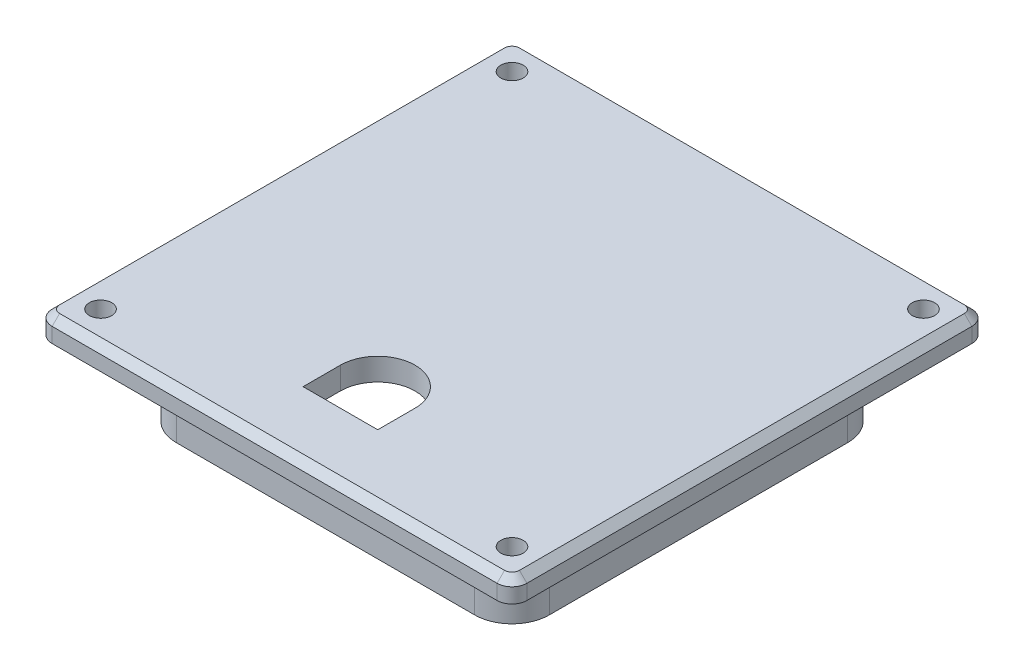
ISO-10303-21;
HEADER;
FILE_DESCRIPTION(('STEP AP214'),'2;1');
FILE_NAME('part.step','',(''),(''),'','','');
FILE_SCHEMA(('AUTOMOTIVE_DESIGN { 1 0 10303 214 1 1 1 1 }'));
ENDSEC;
DATA;
#1=APPLICATION_CONTEXT('core data for automotive mechanical design processes');
#2=APPLICATION_PROTOCOL_DEFINITION('international standard','automotive_design',2000,#1);
#3=PRODUCT_CONTEXT('',#1,'mechanical');
#4=PRODUCT('Part','Part','',(#3));
#5=PRODUCT_RELATED_PRODUCT_CATEGORY('part','',(#4));
#6=PRODUCT_DEFINITION_FORMATION('','',#4);
#7=PRODUCT_DEFINITION_CONTEXT('part definition',#1,'design');
#8=PRODUCT_DEFINITION('design','',#6,#7);
#9=PRODUCT_DEFINITION_SHAPE('','',#8);
#10=(LENGTH_UNIT() NAMED_UNIT(*) SI_UNIT(.MILLI.,.METRE.));
#11=(NAMED_UNIT(*) PLANE_ANGLE_UNIT() SI_UNIT($,.RADIAN.));
#12=(NAMED_UNIT(*) SI_UNIT($,.STERADIAN.) SOLID_ANGLE_UNIT());
#13=UNCERTAINTY_MEASURE_WITH_UNIT(LENGTH_MEASURE(1.E-05),#10,'distance_accuracy_value','');
#14=(GEOMETRIC_REPRESENTATION_CONTEXT(3) GLOBAL_UNCERTAINTY_ASSIGNED_CONTEXT((#13)) GLOBAL_UNIT_ASSIGNED_CONTEXT((#10,
#11,#12)) REPRESENTATION_CONTEXT('',''));
#15=CARTESIAN_POINT('',(0.,0.,0.));
#16=DIRECTION('',(0.,0.,1.));
#17=DIRECTION('',(1.,0.,0.));
#18=AXIS2_PLACEMENT_3D('',#15,#16,#17);
#19=CARTESIAN_POINT('',(0.,0.,0.));
#20=DIRECTION('',(0.,1.,0.));
#21=DIRECTION('',(0.,0.,1.));
#22=AXIS2_PLACEMENT_3D('',#19,#20,#21);
#23=PLANE('',#22);
#24=DIRECTION('',(1.,0.,0.));
#25=VECTOR('',#24,1.);
#26=CARTESIAN_POINT('',(-25.,0.,25.));
#27=LINE('',#26,#25);
#28=CARTESIAN_POINT('',(-20.,0.,25.));
#29=VERTEX_POINT('',#28);
#30=CARTESIAN_POINT('',(20.,0.,25.));
#31=VERTEX_POINT('',#30);
#32=EDGE_CURVE('E354',#29,#31,#27,.T.);
#33=ORIENTED_EDGE('',*,*,#32,.F.);
#34=CARTESIAN_POINT('',(-20.,0.,20.));
#35=DIRECTION('',(0.,1.,0.));
#36=DIRECTION('',(0.,0.,1.));
#37=AXIS2_PLACEMENT_3D('',#34,#35,#36);
#38=CIRCLE('',#37,5.);
#39=CARTESIAN_POINT('',(-25.,0.,20.));
#40=VERTEX_POINT('',#39);
#41=EDGE_CURVE('E372',#29,#40,#38,.F.);
#42=ORIENTED_EDGE('',*,*,#41,.T.);
#43=DIRECTION('',(0.,0.,1.));
#44=VECTOR('',#43,1.);
#45=CARTESIAN_POINT('',(-25.,0.,-25.));
#46=LINE('',#45,#44);
#47=CARTESIAN_POINT('',(-25.,0.,-20.));
#48=VERTEX_POINT('',#47);
#49=EDGE_CURVE('E337',#48,#40,#46,.T.);
#50=ORIENTED_EDGE('',*,*,#49,.F.);
#51=CARTESIAN_POINT('',(-20.,0.,-20.));
#52=DIRECTION('',(0.,1.,0.));
#53=DIRECTION('',(0.,0.,1.));
#54=AXIS2_PLACEMENT_3D('',#51,#52,#53);
#55=CIRCLE('',#54,5.);
#56=CARTESIAN_POINT('',(-20.,0.,-25.));
#57=VERTEX_POINT('',#56);
#58=EDGE_CURVE('E366',#48,#57,#55,.F.);
#59=ORIENTED_EDGE('',*,*,#58,.T.);
#60=DIRECTION('',(-1.,0.,0.));
#61=VECTOR('',#60,1.);
#62=CARTESIAN_POINT('',(-25.,0.,-25.));
#63=LINE('',#62,#61);
#64=CARTESIAN_POINT('',(20.,0.,-25.));
#65=VERTEX_POINT('',#64);
#66=EDGE_CURVE('E342',#65,#57,#63,.T.);
#67=ORIENTED_EDGE('',*,*,#66,.F.);
#68=CARTESIAN_POINT('',(20.,0.,-20.));
#69=DIRECTION('',(0.,1.,0.));
#70=DIRECTION('',(0.,0.,1.));
#71=AXIS2_PLACEMENT_3D('',#68,#69,#70);
#72=CIRCLE('',#71,5.);
#73=CARTESIAN_POINT('',(25.,0.,-20.));
#74=VERTEX_POINT('',#73);
#75=EDGE_CURVE('E368',#65,#74,#72,.F.);
#76=ORIENTED_EDGE('',*,*,#75,.T.);
#77=DIRECTION('',(0.,0.,-1.));
#78=VECTOR('',#77,1.);
#79=CARTESIAN_POINT('',(25.,0.,-25.));
#80=LINE('',#79,#78);
#81=CARTESIAN_POINT('',(25.,0.,20.));
#82=VERTEX_POINT('',#81);
#83=EDGE_CURVE('E357',#82,#74,#80,.T.);
#84=ORIENTED_EDGE('',*,*,#83,.F.);
#85=CARTESIAN_POINT('',(20.,0.,20.));
#86=DIRECTION('',(0.,1.,0.));
#87=DIRECTION('',(0.,0.,1.));
#88=AXIS2_PLACEMENT_3D('',#85,#86,#87);
#89=CIRCLE('',#88,5.);
#90=EDGE_CURVE('E370',#82,#31,#89,.F.);
#91=ORIENTED_EDGE('',*,*,#90,.T.);
#92=EDGE_LOOP('',(#33,#42,#50,#59,#67,#76,#84,#91));
#93=FACE_BOUND('',#92,.T.);
#94=DIRECTION('',(0.,0.,1.));
#95=VECTOR('',#94,1.);
#96=CARTESIAN_POINT('',(-23.,0.,-23.));
#97=LINE('',#96,#95);
#98=CARTESIAN_POINT('',(-23.,0.,-23.));
#99=VERTEX_POINT('',#98);
#100=CARTESIAN_POINT('',(-23.,0.,23.));
#101=VERTEX_POINT('',#100);
#102=EDGE_CURVE('E302',#99,#101,#97,.T.);
#103=ORIENTED_EDGE('',*,*,#102,.T.);
#104=DIRECTION('',(1.,0.,0.));
#105=VECTOR('',#104,1.);
#106=CARTESIAN_POINT('',(-23.,0.,23.));
#107=LINE('',#106,#105);
#108=CARTESIAN_POINT('',(23.,0.,23.));
#109=VERTEX_POINT('',#108);
#110=EDGE_CURVE('E320',#101,#109,#107,.T.);
#111=ORIENTED_EDGE('',*,*,#110,.T.);
#112=DIRECTION('',(0.,0.,-1.));
#113=VECTOR('',#112,1.);
#114=CARTESIAN_POINT('',(23.,0.,-23.));
#115=LINE('',#114,#113);
#116=CARTESIAN_POINT('',(23.,0.,-23.));
#117=VERTEX_POINT('',#116);
#118=EDGE_CURVE('E323',#109,#117,#115,.T.);
#119=ORIENTED_EDGE('',*,*,#118,.T.);
#120=DIRECTION('',(-1.,0.,0.));
#121=VECTOR('',#120,1.);
#122=CARTESIAN_POINT('',(-23.,0.,-23.));
#123=LINE('',#122,#121);
#124=EDGE_CURVE('E307',#117,#99,#123,.T.);
#125=ORIENTED_EDGE('',*,*,#124,.T.);
#126=EDGE_LOOP('',(#103,#111,#119,#125));
#127=FACE_BOUND('',#126,.T.);
#128=ADVANCED_FACE('F39',(#93,#127),#23,.F.);
#129=CARTESIAN_POINT('',(-25.,10.,-25.));
#130=DIRECTION('',(1.,0.,0.));
#131=DIRECTION('',(0.,0.,-1.));
#132=AXIS2_PLACEMENT_3D('',#129,#130,#131);
#133=PLANE('',#132);
#134=ORIENTED_EDGE('',*,*,#49,.T.);
#135=DIRECTION('',(0.,-1.,0.));
#136=VECTOR('',#135,1.);
#137=CARTESIAN_POINT('',(-25.,10.,20.));
#138=LINE('',#137,#136);
#139=CARTESIAN_POINT('',(-25.,10.,20.));
#140=VERTEX_POINT('',#139);
#141=EDGE_CURVE('E377',#40,#140,#138,.F.);
#142=ORIENTED_EDGE('',*,*,#141,.T.);
#143=DIRECTION('',(0.,0.,1.));
#144=VECTOR('',#143,1.);
#145=CARTESIAN_POINT('',(-25.,10.,-25.));
#146=LINE('',#145,#144);
#147=CARTESIAN_POINT('',(-25.,10.,-20.));
#148=VERTEX_POINT('',#147);
#149=EDGE_CURVE('E338',#148,#140,#146,.T.);
#150=ORIENTED_EDGE('',*,*,#149,.F.);
#151=DIRECTION('',(0.,-1.,0.));
#152=VECTOR('',#151,1.);
#153=CARTESIAN_POINT('',(-25.,10.,-20.));
#154=LINE('',#153,#152);
#155=EDGE_CURVE('E374',#148,#48,#154,.T.);
#156=ORIENTED_EDGE('',*,*,#155,.T.);
#157=EDGE_LOOP('',(#134,#142,#150,#156));
#158=FACE_BOUND('',#157,.T.);
#159=ADVANCED_FACE('F550',(#158),#133,.F.);
#160=CARTESIAN_POINT('',(-25.,10.,25.));
#161=DIRECTION('',(0.,0.,-1.));
#162=DIRECTION('',(-1.,0.,0.));
#163=AXIS2_PLACEMENT_3D('',#160,#161,#162);
#164=PLANE('',#163);
#165=DIRECTION('',(1.,0.,0.));
#166=VECTOR('',#165,1.);
#167=CARTESIAN_POINT('',(-25.,10.,25.));
#168=LINE('',#167,#166);
#169=CARTESIAN_POINT('',(-20.,10.,25.));
#170=VERTEX_POINT('',#169);
#171=CARTESIAN_POINT('',(20.,10.,25.));
#172=VERTEX_POINT('',#171);
#173=EDGE_CURVE('E341',#170,#172,#168,.T.);
#174=ORIENTED_EDGE('',*,*,#173,.F.);
#175=DIRECTION('',(0.,-1.,0.));
#176=VECTOR('',#175,1.);
#177=CARTESIAN_POINT('',(-20.,10.,25.));
#178=LINE('',#177,#176);
#179=EDGE_CURVE('E363',#170,#29,#178,.T.);
#180=ORIENTED_EDGE('',*,*,#179,.T.);
#181=ORIENTED_EDGE('',*,*,#32,.T.);
#182=DIRECTION('',(0.,-1.,0.));
#183=VECTOR('',#182,1.);
#184=CARTESIAN_POINT('',(20.,10.,25.));
#185=LINE('',#184,#183);
#186=EDGE_CURVE('E351',#31,#172,#185,.F.);
#187=ORIENTED_EDGE('',*,*,#186,.T.);
#188=EDGE_LOOP('',(#174,#180,#181,#187));
#189=FACE_BOUND('',#188,.T.);
#190=ADVANCED_FACE('F556',(#189),#164,.F.);
#191=CARTESIAN_POINT('',(25.,10.,-25.));
#192=DIRECTION('',(-1.,0.,0.));
#193=DIRECTION('',(0.,0.,1.));
#194=AXIS2_PLACEMENT_3D('',#191,#192,#193);
#195=PLANE('',#194);
#196=DIRECTION('',(0.,0.,-1.));
#197=VECTOR('',#196,1.);
#198=CARTESIAN_POINT('',(25.,10.,-25.));
#199=LINE('',#198,#197);
#200=CARTESIAN_POINT('',(25.,10.,20.));
#201=VERTEX_POINT('',#200);
#202=CARTESIAN_POINT('',(25.,10.,-20.));
#203=VERTEX_POINT('',#202);
#204=EDGE_CURVE('E345',#201,#203,#199,.T.);
#205=ORIENTED_EDGE('',*,*,#204,.F.);
#206=DIRECTION('',(0.,-1.,0.));
#207=VECTOR('',#206,1.);
#208=CARTESIAN_POINT('',(25.,10.,20.));
#209=LINE('',#208,#207);
#210=EDGE_CURVE('E381',#201,#82,#209,.T.);
#211=ORIENTED_EDGE('',*,*,#210,.T.);
#212=ORIENTED_EDGE('',*,*,#83,.T.);
#213=DIRECTION('',(0.,-1.,0.));
#214=VECTOR('',#213,1.);
#215=CARTESIAN_POINT('',(25.,10.,-20.));
#216=LINE('',#215,#214);
#217=EDGE_CURVE('E379',#74,#203,#216,.F.);
#218=ORIENTED_EDGE('',*,*,#217,.T.);
#219=EDGE_LOOP('',(#205,#211,#212,#218));
#220=FACE_BOUND('',#219,.T.);
#221=ADVANCED_FACE('F568',(#220),#195,.F.);
#222=CARTESIAN_POINT('',(-25.,10.,-25.));
#223=DIRECTION('',(0.,0.,1.));
#224=DIRECTION('',(1.,0.,0.));
#225=AXIS2_PLACEMENT_3D('',#222,#223,#224);
#226=PLANE('',#225);
#227=DIRECTION('',(-1.,0.,0.));
#228=VECTOR('',#227,1.);
#229=CARTESIAN_POINT('',(-25.,10.,-25.));
#230=LINE('',#229,#228);
#231=CARTESIAN_POINT('',(20.,10.,-25.));
#232=VERTEX_POINT('',#231);
#233=CARTESIAN_POINT('',(-20.,10.,-25.));
#234=VERTEX_POINT('',#233);
#235=EDGE_CURVE('E348',#232,#234,#230,.T.);
#236=ORIENTED_EDGE('',*,*,#235,.F.);
#237=DIRECTION('',(0.,-1.,0.));
#238=VECTOR('',#237,1.);
#239=CARTESIAN_POINT('',(20.,10.,-25.));
#240=LINE('',#239,#238);
#241=EDGE_CURVE('E386',#232,#65,#240,.T.);
#242=ORIENTED_EDGE('',*,*,#241,.T.);
#243=ORIENTED_EDGE('',*,*,#66,.T.);
#244=DIRECTION('',(0.,-1.,0.));
#245=VECTOR('',#244,1.);
#246=CARTESIAN_POINT('',(-20.,10.,-25.));
#247=LINE('',#246,#245);
#248=EDGE_CURVE('E384',#57,#234,#247,.F.);
#249=ORIENTED_EDGE('',*,*,#248,.T.);
#250=EDGE_LOOP('',(#236,#242,#243,#249));
#251=FACE_BOUND('',#250,.T.);
#252=ADVANCED_FACE('F565',(#251),#226,.F.);
#253=CARTESIAN_POINT('',(-23.,10.,-23.));
#254=DIRECTION('',(1.,0.,0.));
#255=DIRECTION('',(0.,0.,-1.));
#256=AXIS2_PLACEMENT_3D('',#253,#254,#255);
#257=PLANE('',#256);
#258=ORIENTED_EDGE('',*,*,#102,.F.);
#259=DIRECTION('',(0.,-1.,0.));
#260=VECTOR('',#259,1.);
#261=CARTESIAN_POINT('',(-23.,10.,-23.));
#262=LINE('',#261,#260);
#263=CARTESIAN_POINT('',(-23.,10.,-23.));
#264=VERTEX_POINT('',#263);
#265=EDGE_CURVE('E317',#264,#99,#262,.T.);
#266=ORIENTED_EDGE('',*,*,#265,.F.);
#267=DIRECTION('',(0.,0.,1.));
#268=VECTOR('',#267,1.);
#269=CARTESIAN_POINT('',(-23.,10.,-23.));
#270=LINE('',#269,#268);
#271=CARTESIAN_POINT('',(-23.,10.,23.));
#272=VERTEX_POINT('',#271);
#273=EDGE_CURVE('E303',#264,#272,#270,.T.);
#274=ORIENTED_EDGE('',*,*,#273,.T.);
#275=DIRECTION('',(0.,-1.,0.));
#276=VECTOR('',#275,1.);
#277=CARTESIAN_POINT('',(-23.,10.,23.));
#278=LINE('',#277,#276);
#279=EDGE_CURVE('E334',#272,#101,#278,.T.);
#280=ORIENTED_EDGE('',*,*,#279,.T.);
#281=EDGE_LOOP('',(#258,#266,#274,#280));
#282=FACE_BOUND('',#281,.T.);
#283=ADVANCED_FACE('F563',(#282),#257,.T.);
#284=CARTESIAN_POINT('',(-23.,10.,23.));
#285=DIRECTION('',(0.,0.,-1.));
#286=DIRECTION('',(-1.,0.,0.));
#287=AXIS2_PLACEMENT_3D('',#284,#285,#286);
#288=PLANE('',#287);
#289=ORIENTED_EDGE('',*,*,#110,.F.);
#290=ORIENTED_EDGE('',*,*,#279,.F.);
#291=DIRECTION('',(1.,0.,0.));
#292=VECTOR('',#291,1.);
#293=CARTESIAN_POINT('',(-23.,10.,23.));
#294=LINE('',#293,#292);
#295=CARTESIAN_POINT('',(-5.,10.,23.));
#296=VERTEX_POINT('',#295);
#297=EDGE_CURVE('E308',#272,#296,#294,.T.);
#298=ORIENTED_EDGE('',*,*,#297,.T.);
#299=DIRECTION('',(0.,-1.,0.));
#300=VECTOR('',#299,1.);
#301=CARTESIAN_POINT('',(-5.,13.,23.));
#302=LINE('',#301,#300);
#303=CARTESIAN_POINT('',(-5.,13.,23.));
#304=VERTEX_POINT('',#303);
#305=EDGE_CURVE('E246',#304,#296,#302,.T.);
#306=ORIENTED_EDGE('',*,*,#305,.F.);
#307=DIRECTION('',(1.,0.,0.));
#308=VECTOR('',#307,1.);
#309=CARTESIAN_POINT('',(-5.,13.,23.));
#310=LINE('',#309,#308);
#311=CARTESIAN_POINT('',(5.,13.,23.));
#312=VERTEX_POINT('',#311);
#313=EDGE_CURVE('E251',#304,#312,#310,.T.);
#314=ORIENTED_EDGE('',*,*,#313,.T.);
#315=DIRECTION('',(0.,-1.,0.));
#316=VECTOR('',#315,1.);
#317=CARTESIAN_POINT('',(5.,13.,23.));
#318=LINE('',#317,#316);
#319=CARTESIAN_POINT('',(5.,10.,23.));
#320=VERTEX_POINT('',#319);
#321=EDGE_CURVE('E263',#312,#320,#318,.T.);
#322=ORIENTED_EDGE('',*,*,#321,.T.);
#323=CARTESIAN_POINT('',(23.,10.,23.));
#324=VERTEX_POINT('',#323);
#325=EDGE_CURVE('E306',#320,#324,#294,.T.);
#326=ORIENTED_EDGE('',*,*,#325,.T.);
#327=DIRECTION('',(0.,-1.,0.));
#328=VECTOR('',#327,1.);
#329=CARTESIAN_POINT('',(23.,10.,23.));
#330=LINE('',#329,#328);
#331=EDGE_CURVE('E332',#324,#109,#330,.T.);
#332=ORIENTED_EDGE('',*,*,#331,.T.);
#333=EDGE_LOOP('',(#289,#290,#298,#306,#314,#322,#326,#332));
#334=FACE_BOUND('',#333,.T.);
#335=ADVANCED_FACE('F778',(#334),#288,.T.);
#336=CARTESIAN_POINT('',(23.,10.,-23.));
#337=DIRECTION('',(-1.,0.,0.));
#338=DIRECTION('',(0.,0.,1.));
#339=AXIS2_PLACEMENT_3D('',#336,#337,#338);
#340=PLANE('',#339);
#341=ORIENTED_EDGE('',*,*,#118,.F.);
#342=ORIENTED_EDGE('',*,*,#331,.F.);
#343=DIRECTION('',(0.,0.,-1.));
#344=VECTOR('',#343,1.);
#345=CARTESIAN_POINT('',(23.,10.,-23.));
#346=LINE('',#345,#344);
#347=CARTESIAN_POINT('',(23.,10.,-23.));
#348=VERTEX_POINT('',#347);
#349=EDGE_CURVE('E311',#324,#348,#346,.T.);
#350=ORIENTED_EDGE('',*,*,#349,.T.);
#351=DIRECTION('',(0.,-1.,0.));
#352=VECTOR('',#351,1.);
#353=CARTESIAN_POINT('',(23.,10.,-23.));
#354=LINE('',#353,#352);
#355=EDGE_CURVE('E330',#348,#117,#354,.T.);
#356=ORIENTED_EDGE('',*,*,#355,.T.);
#357=EDGE_LOOP('',(#341,#342,#350,#356));
#358=FACE_BOUND('',#357,.T.);
#359=ADVANCED_FACE('F770',(#358),#340,.T.);
#360=CARTESIAN_POINT('',(-23.,10.,-23.));
#361=DIRECTION('',(0.,0.,1.));
#362=DIRECTION('',(1.,0.,0.));
#363=AXIS2_PLACEMENT_3D('',#360,#361,#362);
#364=PLANE('',#363);
#365=ORIENTED_EDGE('',*,*,#124,.F.);
#366=ORIENTED_EDGE('',*,*,#355,.F.);
#367=DIRECTION('',(-1.,0.,0.));
#368=VECTOR('',#367,1.);
#369=CARTESIAN_POINT('',(-23.,10.,-23.));
#370=LINE('',#369,#368);
#371=EDGE_CURVE('E314',#348,#264,#370,.T.);
#372=ORIENTED_EDGE('',*,*,#371,.T.);
#373=ORIENTED_EDGE('',*,*,#265,.T.);
#374=EDGE_LOOP('',(#365,#366,#372,#373));
#375=FACE_BOUND('',#374,.T.);
#376=ADVANCED_FACE('F765',(#375),#364,.T.);
#377=CARTESIAN_POINT('',(0.,10.,0.));
#378=DIRECTION('',(0.,1.,0.));
#379=DIRECTION('',(0.,0.,1.));
#380=AXIS2_PLACEMENT_3D('',#377,#378,#379);
#381=PLANE('',#380);
#382=DIRECTION('',(-1.,0.,0.));
#383=VECTOR('',#382,1.);
#384=CARTESIAN_POINT('',(-31.8198051533946,10.,-31.8198051533947));
#385=LINE('',#384,#383);
#386=CARTESIAN_POINT('',(29.8198051533947,10.,-31.8198051533947));
#387=VERTEX_POINT('',#386);
#388=CARTESIAN_POINT('',(-29.8198051533946,10.,-31.8198051533947));
#389=VERTEX_POINT('',#388);
#390=EDGE_CURVE('E293',#387,#389,#385,.T.);
#391=ORIENTED_EDGE('',*,*,#390,.F.);
#392=CARTESIAN_POINT('',(29.8198051533947,10.,-29.8198051533947));
#393=DIRECTION('',(0.,1.,0.));
#394=DIRECTION('',(0.,0.,1.));
#395=AXIS2_PLACEMENT_3D('',#392,#393,#394);
#396=CIRCLE('',#395,2.);
#397=CARTESIAN_POINT('',(31.8198051533947,10.,-29.8198051533947));
#398=VERTEX_POINT('',#397);
#399=EDGE_CURVE('E408',#387,#398,#396,.F.);
#400=ORIENTED_EDGE('',*,*,#399,.T.);
#401=DIRECTION('',(0.,0.,-1.));
#402=VECTOR('',#401,1.);
#403=CARTESIAN_POINT('',(31.8198051533947,10.,-31.8198051533947));
#404=LINE('',#403,#402);
#405=CARTESIAN_POINT('',(31.8198051533947,10.,29.8198051533946));
#406=VERTEX_POINT('',#405);
#407=EDGE_CURVE('E288',#406,#398,#404,.T.);
#408=ORIENTED_EDGE('',*,*,#407,.F.);
#409=CARTESIAN_POINT('',(29.8198051533947,10.,29.8198051533946));
#410=DIRECTION('',(0.,1.,0.));
#411=DIRECTION('',(0.,0.,1.));
#412=AXIS2_PLACEMENT_3D('',#409,#410,#411);
#413=CIRCLE('',#412,2.);
#414=CARTESIAN_POINT('',(29.8198051533947,10.,31.8198051533946));
#415=VERTEX_POINT('',#414);
#416=EDGE_CURVE('E402',#406,#415,#413,.F.);
#417=ORIENTED_EDGE('',*,*,#416,.T.);
#418=DIRECTION('',(1.,0.,0.));
#419=VECTOR('',#418,1.);
#420=CARTESIAN_POINT('',(-31.8198051533946,10.,31.8198051533946));
#421=LINE('',#420,#419);
#422=CARTESIAN_POINT('',(-29.8198051533946,10.,31.8198051533946));
#423=VERTEX_POINT('',#422);
#424=EDGE_CURVE('E299',#423,#415,#421,.T.);
#425=ORIENTED_EDGE('',*,*,#424,.F.);
#426=CARTESIAN_POINT('',(-29.8198051533946,10.,29.8198051533946));
#427=DIRECTION('',(0.,1.,0.));
#428=DIRECTION('',(0.,0.,1.));
#429=AXIS2_PLACEMENT_3D('',#426,#427,#428);
#430=CIRCLE('',#429,2.);
#431=CARTESIAN_POINT('',(-31.8198051533946,10.,29.8198051533946));
#432=VERTEX_POINT('',#431);
#433=EDGE_CURVE('E404',#423,#432,#430,.F.);
#434=ORIENTED_EDGE('',*,*,#433,.T.);
#435=DIRECTION('',(0.,0.,1.));
#436=VECTOR('',#435,1.);
#437=CARTESIAN_POINT('',(-31.8198051533946,10.,-31.8198051533947));
#438=LINE('',#437,#436);
#439=CARTESIAN_POINT('',(-31.8198051533946,10.,-29.8198051533947));
#440=VERTEX_POINT('',#439);
#441=EDGE_CURVE('E296',#440,#432,#438,.T.);
#442=ORIENTED_EDGE('',*,*,#441,.F.);
#443=CARTESIAN_POINT('',(-29.8198051533946,10.,-29.8198051533947));
#444=DIRECTION('',(0.,1.,0.));
#445=DIRECTION('',(0.,0.,1.));
#446=AXIS2_PLACEMENT_3D('',#443,#444,#445);
#447=CIRCLE('',#446,2.);
#448=EDGE_CURVE('E406',#440,#389,#447,.F.);
#449=ORIENTED_EDGE('',*,*,#448,.T.);
#450=EDGE_LOOP('',(#391,#400,#408,#417,#425,#434,#442,#449));
#451=FACE_BOUND('',#450,.T.);
#452=CARTESIAN_POINT('',(-27.5771644662753,10.,-27.5771644662754));
#453=DIRECTION('',(0.,1.,0.));
#454=DIRECTION('',(0.,0.,1.));
#455=AXIS2_PLACEMENT_3D('',#452,#453,#454);
#456=CIRCLE('',#455,1.5);
#457=CARTESIAN_POINT('',(-27.5771644662753,10.,-26.0771644662754));
#458=VERTEX_POINT('',#457);
#459=EDGE_CURVE('E282',#458,#458,#456,.T.);
#460=ORIENTED_EDGE('',*,*,#459,.T.);
#461=EDGE_LOOP('',(#460));
#462=FACE_BOUND('',#461,.T.);
#463=CARTESIAN_POINT('',(27.5771644662753,10.,-27.5771644662754));
#464=DIRECTION('',(0.,1.,0.));
#465=DIRECTION('',(0.,0.,1.));
#466=AXIS2_PLACEMENT_3D('',#463,#464,#465);
#467=CIRCLE('',#466,1.50000000000003);
#468=CARTESIAN_POINT('',(27.5771644662753,10.,-26.0771644662754));
#469=VERTEX_POINT('',#468);
#470=EDGE_CURVE('E276',#469,#469,#467,.T.);
#471=ORIENTED_EDGE('',*,*,#470,.T.);
#472=EDGE_LOOP('',(#471));
#473=FACE_BOUND('',#472,.T.);
#474=CARTESIAN_POINT('',(-27.5771644662753,10.,27.5771644662754));
#475=DIRECTION('',(0.,1.,0.));
#476=DIRECTION('',(0.,0.,1.));
#477=AXIS2_PLACEMENT_3D('',#474,#475,#476);
#478=CIRCLE('',#477,1.50000000000001);
#479=CARTESIAN_POINT('',(-27.5771644662753,10.,29.0771644662754));
#480=VERTEX_POINT('',#479);
#481=EDGE_CURVE('E270',#480,#480,#478,.T.);
#482=ORIENTED_EDGE('',*,*,#481,.T.);
#483=EDGE_LOOP('',(#482));
#484=FACE_BOUND('',#483,.T.);
#485=CARTESIAN_POINT('',(27.5771644662752,10.,27.5771644662755));
#486=DIRECTION('',(0.,1.,0.));
#487=DIRECTION('',(0.,0.,1.));
#488=AXIS2_PLACEMENT_3D('',#485,#486,#487);
#489=CIRCLE('',#488,1.50000000000008);
#490=CARTESIAN_POINT('',(27.5771644662752,10.,29.0771644662755));
#491=VERTEX_POINT('',#490);
#492=EDGE_CURVE('E245',#491,#491,#489,.T.);
#493=ORIENTED_EDGE('',*,*,#492,.T.);
#494=EDGE_LOOP('',(#493));
#495=FACE_BOUND('',#494,.T.);
#496=ORIENTED_EDGE('',*,*,#204,.T.);
#497=CARTESIAN_POINT('',(20.,10.,-20.));
#498=DIRECTION('',(0.,1.,0.));
#499=DIRECTION('',(0.,0.,1.));
#500=AXIS2_PLACEMENT_3D('',#497,#498,#499);
#501=CIRCLE('',#500,5.);
#502=EDGE_CURVE('E393',#203,#232,#501,.T.);
#503=ORIENTED_EDGE('',*,*,#502,.T.);
#504=ORIENTED_EDGE('',*,*,#235,.T.);
#505=CARTESIAN_POINT('',(-20.,10.,-20.));
#506=DIRECTION('',(0.,1.,0.));
#507=DIRECTION('',(0.,0.,1.));
#508=AXIS2_PLACEMENT_3D('',#505,#506,#507);
#509=CIRCLE('',#508,5.);
#510=EDGE_CURVE('E395',#234,#148,#509,.T.);
#511=ORIENTED_EDGE('',*,*,#510,.T.);
#512=ORIENTED_EDGE('',*,*,#149,.T.);
#513=CARTESIAN_POINT('',(-20.,10.,20.));
#514=DIRECTION('',(0.,1.,0.));
#515=DIRECTION('',(0.,0.,1.));
#516=AXIS2_PLACEMENT_3D('',#513,#514,#515);
#517=CIRCLE('',#516,5.);
#518=EDGE_CURVE('E389',#140,#170,#517,.T.);
#519=ORIENTED_EDGE('',*,*,#518,.T.);
#520=ORIENTED_EDGE('',*,*,#173,.T.);
#521=CARTESIAN_POINT('',(20.,10.,20.));
#522=DIRECTION('',(0.,1.,0.));
#523=DIRECTION('',(0.,0.,1.));
#524=AXIS2_PLACEMENT_3D('',#521,#522,#523);
#525=CIRCLE('',#524,5.);
#526=EDGE_CURVE('E391',#172,#201,#525,.T.);
#527=ORIENTED_EDGE('',*,*,#526,.T.);
#528=EDGE_LOOP('',(#496,#503,#504,#511,#512,#519,#520,#527));
#529=FACE_BOUND('',#528,.T.);
#530=ADVANCED_FACE('F497',(#451,#462,#473,#484,#495,#529),#381,.F.);
#531=CARTESIAN_POINT('',(0.,13.,0.));
#532=DIRECTION('',(0.,1.,0.));
#533=DIRECTION('',(0.,0.,1.));
#534=AXIS2_PLACEMENT_3D('',#531,#532,#533);
#535=PLANE('',#534);
#536=CARTESIAN_POINT('',(29.8198051533947,13.,29.8198051533946));
#537=DIRECTION('',(0.,1.,0.));
#538=DIRECTION('',(0.,0.,1.));
#539=AXIS2_PLACEMENT_3D('',#536,#537,#538);
#540=CIRCLE('',#539,1.);
#541=CARTESIAN_POINT('',(29.8198051533947,13.,30.8198051533946));
#542=VERTEX_POINT('',#541);
#543=CARTESIAN_POINT('',(30.8198051533947,13.,29.8198051533946));
#544=VERTEX_POINT('',#543);
#545=EDGE_CURVE('E434',#542,#544,#540,.T.);
#546=ORIENTED_EDGE('',*,*,#545,.T.);
#547=DIRECTION('',(0.,0.,-1.));
#548=VECTOR('',#547,1.);
#549=CARTESIAN_POINT('',(30.8198051533947,13.,-29.8198051533947));
#550=LINE('',#549,#548);
#551=CARTESIAN_POINT('',(30.8198051533947,13.,-29.8198051533947));
#552=VERTEX_POINT('',#551);
#553=EDGE_CURVE('E438',#544,#552,#550,.T.);
#554=ORIENTED_EDGE('',*,*,#553,.T.);
#555=CARTESIAN_POINT('',(29.8198051533947,13.,-29.8198051533947));
#556=DIRECTION('',(0.,1.,0.));
#557=DIRECTION('',(0.,0.,1.));
#558=AXIS2_PLACEMENT_3D('',#555,#556,#557);
#559=CIRCLE('',#558,1.);
#560=CARTESIAN_POINT('',(29.8198051533947,13.,-30.8198051533947));
#561=VERTEX_POINT('',#560);
#562=EDGE_CURVE('E436',#552,#561,#559,.T.);
#563=ORIENTED_EDGE('',*,*,#562,.T.);
#564=DIRECTION('',(-1.,0.,0.));
#565=VECTOR('',#564,1.);
#566=CARTESIAN_POINT('',(-29.8198051533946,13.,-30.8198051533947));
#567=LINE('',#566,#565);
#568=CARTESIAN_POINT('',(-29.8198051533946,13.,-30.8198051533947));
#569=VERTEX_POINT('',#568);
#570=EDGE_CURVE('E432',#561,#569,#567,.T.);
#571=ORIENTED_EDGE('',*,*,#570,.T.);
#572=CARTESIAN_POINT('',(-29.8198051533946,13.,-29.8198051533947));
#573=DIRECTION('',(0.,1.,0.));
#574=DIRECTION('',(0.,0.,1.));
#575=AXIS2_PLACEMENT_3D('',#572,#573,#574);
#576=CIRCLE('',#575,1.);
#577=CARTESIAN_POINT('',(-30.8198051533946,13.,-29.8198051533947));
#578=VERTEX_POINT('',#577);
#579=EDGE_CURVE('E428',#569,#578,#576,.T.);
#580=ORIENTED_EDGE('',*,*,#579,.T.);
#581=DIRECTION('',(0.,0.,1.));
#582=VECTOR('',#581,1.);
#583=CARTESIAN_POINT('',(-30.8198051533946,13.,29.8198051533946));
#584=LINE('',#583,#582);
#585=CARTESIAN_POINT('',(-30.8198051533946,13.,29.8198051533946));
#586=VERTEX_POINT('',#585);
#587=EDGE_CURVE('E424',#578,#586,#584,.T.);
#588=ORIENTED_EDGE('',*,*,#587,.T.);
#589=CARTESIAN_POINT('',(-29.8198051533946,13.,29.8198051533946));
#590=DIRECTION('',(0.,1.,0.));
#591=DIRECTION('',(0.,0.,1.));
#592=AXIS2_PLACEMENT_3D('',#589,#590,#591);
#593=CIRCLE('',#592,1.);
#594=CARTESIAN_POINT('',(-29.8198051533946,13.,30.8198051533946));
#595=VERTEX_POINT('',#594);
#596=EDGE_CURVE('E426',#586,#595,#593,.T.);
#597=ORIENTED_EDGE('',*,*,#596,.T.);
#598=DIRECTION('',(1.,0.,0.));
#599=VECTOR('',#598,1.);
#600=CARTESIAN_POINT('',(29.8198051533947,13.,30.8198051533946));
#601=LINE('',#600,#599);
#602=EDGE_CURVE('E430',#595,#542,#601,.T.);
#603=ORIENTED_EDGE('',*,*,#602,.T.);
#604=EDGE_LOOP('',(#546,#554,#563,#571,#580,#588,#597,#603));
#605=FACE_BOUND('',#604,.T.);
#606=CARTESIAN_POINT('',(-27.5771644662753,13.,27.5771644662754));
#607=DIRECTION('',(0.,1.,0.));
#608=DIRECTION('',(0.,0.,1.));
#609=AXIS2_PLACEMENT_3D('',#606,#607,#608);
#610=CIRCLE('',#609,1.50000000000001);
#611=CARTESIAN_POINT('',(-27.5771644662753,13.,29.0771644662754));
#612=VERTEX_POINT('',#611);
#613=EDGE_CURVE('E273',#612,#612,#610,.T.);
#614=ORIENTED_EDGE('',*,*,#613,.F.);
#615=EDGE_LOOP('',(#614));
#616=FACE_BOUND('',#615,.T.);
#617=CARTESIAN_POINT('',(-27.5771644662753,13.,-27.5771644662754));
#618=DIRECTION('',(0.,1.,0.));
#619=DIRECTION('',(0.,0.,1.));
#620=AXIS2_PLACEMENT_3D('',#617,#618,#619);
#621=CIRCLE('',#620,1.5);
#622=CARTESIAN_POINT('',(-27.5771644662753,13.,-26.0771644662754));
#623=VERTEX_POINT('',#622);
#624=EDGE_CURVE('E285',#623,#623,#621,.T.);
#625=ORIENTED_EDGE('',*,*,#624,.F.);
#626=EDGE_LOOP('',(#625));
#627=FACE_BOUND('',#626,.T.);
#628=CARTESIAN_POINT('',(27.5771644662753,13.,-27.5771644662754));
#629=DIRECTION('',(0.,1.,0.));
#630=DIRECTION('',(0.,0.,1.));
#631=AXIS2_PLACEMENT_3D('',#628,#629,#630);
#632=CIRCLE('',#631,1.50000000000003);
#633=CARTESIAN_POINT('',(27.5771644662753,13.,-26.0771644662754));
#634=VERTEX_POINT('',#633);
#635=EDGE_CURVE('E279',#634,#634,#632,.T.);
#636=ORIENTED_EDGE('',*,*,#635,.F.);
#637=EDGE_LOOP('',(#636));
#638=FACE_BOUND('',#637,.T.);
#639=CARTESIAN_POINT('',(27.5771644662752,13.,27.5771644662755));
#640=DIRECTION('',(0.,1.,0.));
#641=DIRECTION('',(0.,0.,1.));
#642=AXIS2_PLACEMENT_3D('',#639,#640,#641);
#643=CIRCLE('',#642,1.50000000000008);
#644=CARTESIAN_POINT('',(27.5771644662752,13.,29.0771644662755));
#645=VERTEX_POINT('',#644);
#646=EDGE_CURVE('E267',#645,#645,#643,.T.);
#647=ORIENTED_EDGE('',*,*,#646,.F.);
#648=EDGE_LOOP('',(#647));
#649=FACE_BOUND('',#648,.T.);
#650=DIRECTION('',(0.,0.,1.));
#651=VECTOR('',#650,1.);
#652=CARTESIAN_POINT('',(-5.,13.,18.));
#653=LINE('',#652,#651);
#654=CARTESIAN_POINT('',(-5.,13.,18.));
#655=VERTEX_POINT('',#654);
#656=EDGE_CURVE('E237',#655,#304,#653,.T.);
#657=ORIENTED_EDGE('',*,*,#656,.F.);
#658=CARTESIAN_POINT('',(0.,13.,18.));
#659=DIRECTION('',(0.,1.,0.));
#660=DIRECTION('',(0.,0.,1.));
#661=AXIS2_PLACEMENT_3D('',#658,#659,#660);
#662=CIRCLE('',#661,5.);
#663=CARTESIAN_POINT('',(5.,13.,18.));
#664=VERTEX_POINT('',#663);
#665=EDGE_CURVE('E227',#664,#655,#662,.T.);
#666=ORIENTED_EDGE('',*,*,#665,.F.);
#667=DIRECTION('',(0.,0.,-1.));
#668=VECTOR('',#667,1.);
#669=CARTESIAN_POINT('',(5.,13.,18.));
#670=LINE('',#669,#668);
#671=EDGE_CURVE('E253',#312,#664,#670,.T.);
#672=ORIENTED_EDGE('',*,*,#671,.F.);
#673=ORIENTED_EDGE('',*,*,#313,.F.);
#674=EDGE_LOOP('',(#657,#666,#672,#673));
#675=FACE_BOUND('',#674,.T.);
#676=ADVANCED_FACE('F249',(#605,#616,#627,#638,#649,#675),#535,.T.);
#677=ORIENTED_EDGE('',*,*,#297,.F.);
#678=ORIENTED_EDGE('',*,*,#273,.F.);
#679=ORIENTED_EDGE('',*,*,#371,.F.);
#680=ORIENTED_EDGE('',*,*,#349,.F.);
#681=ORIENTED_EDGE('',*,*,#325,.F.);
#682=DIRECTION('',(0.,0.,-1.));
#683=VECTOR('',#682,1.);
#684=CARTESIAN_POINT('',(5.,10.,18.));
#685=LINE('',#684,#683);
#686=CARTESIAN_POINT('',(5.,10.,18.));
#687=VERTEX_POINT('',#686);
#688=EDGE_CURVE('E238',#320,#687,#685,.T.);
#689=ORIENTED_EDGE('',*,*,#688,.T.);
#690=CARTESIAN_POINT('',(0.,10.,18.));
#691=DIRECTION('',(0.,1.,0.));
#692=DIRECTION('',(0.,0.,1.));
#693=AXIS2_PLACEMENT_3D('',#690,#691,#692);
#694=CIRCLE('',#693,5.);
#695=CARTESIAN_POINT('',(-5.,10.,18.));
#696=VERTEX_POINT('',#695);
#697=EDGE_CURVE('E257',#687,#696,#694,.T.);
#698=ORIENTED_EDGE('',*,*,#697,.T.);
#699=DIRECTION('',(0.,0.,1.));
#700=VECTOR('',#699,1.);
#701=CARTESIAN_POINT('',(-5.,10.,18.));
#702=LINE('',#701,#700);
#703=EDGE_CURVE('E244',#696,#296,#702,.T.);
#704=ORIENTED_EDGE('',*,*,#703,.T.);
#705=EDGE_LOOP('',(#677,#678,#679,#680,#681,#689,#698,#704));
#706=FACE_BOUND('',#705,.T.);
#707=ADVANCED_FACE('F746',(#706),#381,.F.);
#708=CARTESIAN_POINT('',(31.8198051533947,13.,-31.8198051533947));
#709=DIRECTION('',(-1.,0.,0.));
#710=DIRECTION('',(0.,0.,1.));
#711=AXIS2_PLACEMENT_3D('',#708,#709,#710);
#712=PLANE('',#711);
#713=DIRECTION('',(0.,-1.,0.));
#714=VECTOR('',#713,1.);
#715=CARTESIAN_POINT('',(31.8198051533947,13.,-29.8198051533947));
#716=LINE('',#715,#714);
#717=CARTESIAN_POINT('',(31.8198051533947,12.,-29.8198051533947));
#718=VERTEX_POINT('',#717);
#719=EDGE_CURVE('E412',#398,#718,#716,.F.);
#720=ORIENTED_EDGE('',*,*,#719,.T.);
#721=DIRECTION('',(0.,0.,1.));
#722=VECTOR('',#721,1.);
#723=CARTESIAN_POINT('',(31.8198051533947,12.,29.8198051533946));
#724=LINE('',#723,#722);
#725=CARTESIAN_POINT('',(31.8198051533947,12.,29.8198051533946));
#726=VERTEX_POINT('',#725);
#727=EDGE_CURVE('E441',#718,#726,#724,.T.);
#728=ORIENTED_EDGE('',*,*,#727,.T.);
#729=DIRECTION('',(0.,-1.,0.));
#730=VECTOR('',#729,1.);
#731=CARTESIAN_POINT('',(31.8198051533947,13.,29.8198051533946));
#732=LINE('',#731,#730);
#733=EDGE_CURVE('E410',#726,#406,#732,.T.);
#734=ORIENTED_EDGE('',*,*,#733,.T.);
#735=ORIENTED_EDGE('',*,*,#407,.T.);
#736=EDGE_LOOP('',(#720,#728,#734,#735));
#737=FACE_BOUND('',#736,.T.);
#738=ADVANCED_FACE('F522',(#737),#712,.F.);
#739=CARTESIAN_POINT('',(-31.8198051533946,13.,-31.8198051533947));
#740=DIRECTION('',(0.,0.,1.));
#741=DIRECTION('',(1.,0.,0.));
#742=AXIS2_PLACEMENT_3D('',#739,#740,#741);
#743=PLANE('',#742);
#744=DIRECTION('',(0.,-1.,0.));
#745=VECTOR('',#744,1.);
#746=CARTESIAN_POINT('',(-29.8198051533946,13.,-31.8198051533947));
#747=LINE('',#746,#745);
#748=CARTESIAN_POINT('',(-29.8198051533946,12.,-31.8198051533947));
#749=VERTEX_POINT('',#748);
#750=EDGE_CURVE('E397',#389,#749,#747,.F.);
#751=ORIENTED_EDGE('',*,*,#750,.T.);
#752=DIRECTION('',(1.,0.,0.));
#753=VECTOR('',#752,1.);
#754=CARTESIAN_POINT('',(29.8198051533947,12.,-31.8198051533947));
#755=LINE('',#754,#753);
#756=CARTESIAN_POINT('',(29.8198051533947,12.,-31.8198051533947));
#757=VERTEX_POINT('',#756);
#758=EDGE_CURVE('E448',#749,#757,#755,.T.);
#759=ORIENTED_EDGE('',*,*,#758,.T.);
#760=DIRECTION('',(0.,-1.,0.));
#761=VECTOR('',#760,1.);
#762=CARTESIAN_POINT('',(29.8198051533947,13.,-31.8198051533947));
#763=LINE('',#762,#761);
#764=EDGE_CURVE('E400',#757,#387,#763,.T.);
#765=ORIENTED_EDGE('',*,*,#764,.T.);
#766=ORIENTED_EDGE('',*,*,#390,.T.);
#767=EDGE_LOOP('',(#751,#759,#765,#766));
#768=FACE_BOUND('',#767,.T.);
#769=ADVANCED_FACE('F492',(#768),#743,.F.);
#770=CARTESIAN_POINT('',(-31.8198051533946,13.,-31.8198051533947));
#771=DIRECTION('',(1.,0.,0.));
#772=DIRECTION('',(0.,0.,-1.));
#773=AXIS2_PLACEMENT_3D('',#770,#771,#772);
#774=PLANE('',#773);
#775=DIRECTION('',(0.,-1.,0.));
#776=VECTOR('',#775,1.);
#777=CARTESIAN_POINT('',(-31.8198051533946,13.,29.8198051533946));
#778=LINE('',#777,#776);
#779=CARTESIAN_POINT('',(-31.8198051533946,12.,29.8198051533946));
#780=VERTEX_POINT('',#779);
#781=EDGE_CURVE('E415',#432,#780,#778,.F.);
#782=ORIENTED_EDGE('',*,*,#781,.T.);
#783=DIRECTION('',(0.,0.,-1.));
#784=VECTOR('',#783,1.);
#785=CARTESIAN_POINT('',(-31.8198051533946,12.,-29.8198051533947));
#786=LINE('',#785,#784);
#787=CARTESIAN_POINT('',(-31.8198051533946,12.,-29.8198051533947));
#788=VERTEX_POINT('',#787);
#789=EDGE_CURVE('E11',#780,#788,#786,.T.);
#790=ORIENTED_EDGE('',*,*,#789,.T.);
#791=DIRECTION('',(0.,-1.,0.));
#792=VECTOR('',#791,1.);
#793=CARTESIAN_POINT('',(-31.8198051533946,13.,-29.8198051533947));
#794=LINE('',#793,#792);
#795=EDGE_CURVE('E417',#788,#440,#794,.T.);
#796=ORIENTED_EDGE('',*,*,#795,.T.);
#797=ORIENTED_EDGE('',*,*,#441,.T.);
#798=EDGE_LOOP('',(#782,#790,#796,#797));
#799=FACE_BOUND('',#798,.T.);
#800=ADVANCED_FACE('F503',(#799),#774,.F.);
#801=CARTESIAN_POINT('',(-31.8198051533946,13.,31.8198051533946));
#802=DIRECTION('',(0.,0.,-1.));
#803=DIRECTION('',(-1.,0.,0.));
#804=AXIS2_PLACEMENT_3D('',#801,#802,#803);
#805=PLANE('',#804);
#806=DIRECTION('',(0.,-1.,0.));
#807=VECTOR('',#806,1.);
#808=CARTESIAN_POINT('',(29.8198051533947,13.,31.8198051533946));
#809=LINE('',#808,#807);
#810=CARTESIAN_POINT('',(29.8198051533947,12.,31.8198051533946));
#811=VERTEX_POINT('',#810);
#812=EDGE_CURVE('E419',#415,#811,#809,.F.);
#813=ORIENTED_EDGE('',*,*,#812,.T.);
#814=DIRECTION('',(-1.,0.,0.));
#815=VECTOR('',#814,1.);
#816=CARTESIAN_POINT('',(-29.8198051533946,12.,31.8198051533946));
#817=LINE('',#816,#815);
#818=CARTESIAN_POINT('',(-29.8198051533946,12.,31.8198051533946));
#819=VERTEX_POINT('',#818);
#820=EDGE_CURVE('E450',#811,#819,#817,.T.);
#821=ORIENTED_EDGE('',*,*,#820,.T.);
#822=DIRECTION('',(0.,-1.,0.));
#823=VECTOR('',#822,1.);
#824=CARTESIAN_POINT('',(-29.8198051533946,13.,31.8198051533946));
#825=LINE('',#824,#823);
#826=EDGE_CURVE('E422',#819,#423,#825,.T.);
#827=ORIENTED_EDGE('',*,*,#826,.T.);
#828=ORIENTED_EDGE('',*,*,#424,.T.);
#829=EDGE_LOOP('',(#813,#821,#827,#828));
#830=FACE_BOUND('',#829,.T.);
#831=ADVANCED_FACE('F508',(#830),#805,.F.);
#832=CARTESIAN_POINT('',(-27.5771644662753,13.,-27.5771644662754));
#833=DIRECTION('',(0.,-1.,0.));
#834=DIRECTION('',(0.,0.,-1.));
#835=AXIS2_PLACEMENT_3D('',#832,#833,#834);
#836=CYLINDRICAL_SURFACE('',#835,1.5);
#837=ORIENTED_EDGE('',*,*,#624,.T.);
#838=EDGE_LOOP('',(#837));
#839=FACE_BOUND('',#838,.T.);
#840=ORIENTED_EDGE('',*,*,#459,.F.);
#841=EDGE_LOOP('',(#840));
#842=FACE_BOUND('',#841,.T.);
#843=ADVANCED_FACE('F713',(#839,#842),#836,.F.);
#844=CARTESIAN_POINT('',(27.5771644662753,13.,-27.5771644662754));
#845=DIRECTION('',(0.,-1.,0.));
#846=DIRECTION('',(0.,0.,-1.));
#847=AXIS2_PLACEMENT_3D('',#844,#845,#846);
#848=CYLINDRICAL_SURFACE('',#847,1.50000000000003);
#849=ORIENTED_EDGE('',*,*,#635,.T.);
#850=EDGE_LOOP('',(#849));
#851=FACE_BOUND('',#850,.T.);
#852=ORIENTED_EDGE('',*,*,#470,.F.);
#853=EDGE_LOOP('',(#852));
#854=FACE_BOUND('',#853,.T.);
#855=ADVANCED_FACE('F705',(#851,#854),#848,.F.);
#856=CARTESIAN_POINT('',(-27.5771644662753,13.,27.5771644662754));
#857=DIRECTION('',(0.,-1.,0.));
#858=DIRECTION('',(0.,0.,-1.));
#859=AXIS2_PLACEMENT_3D('',#856,#857,#858);
#860=CYLINDRICAL_SURFACE('',#859,1.50000000000001);
#861=ORIENTED_EDGE('',*,*,#613,.T.);
#862=EDGE_LOOP('',(#861));
#863=FACE_BOUND('',#862,.T.);
#864=ORIENTED_EDGE('',*,*,#481,.F.);
#865=EDGE_LOOP('',(#864));
#866=FACE_BOUND('',#865,.T.);
#867=ADVANCED_FACE('F697',(#863,#866),#860,.F.);
#868=CARTESIAN_POINT('',(27.5771644662752,13.,27.5771644662755));
#869=DIRECTION('',(0.,-1.,0.));
#870=DIRECTION('',(0.,0.,-1.));
#871=AXIS2_PLACEMENT_3D('',#868,#869,#870);
#872=CYLINDRICAL_SURFACE('',#871,1.50000000000008);
#873=ORIENTED_EDGE('',*,*,#646,.T.);
#874=EDGE_LOOP('',(#873));
#875=FACE_BOUND('',#874,.T.);
#876=ORIENTED_EDGE('',*,*,#492,.F.);
#877=EDGE_LOOP('',(#876));
#878=FACE_BOUND('',#877,.T.);
#879=ADVANCED_FACE('F690',(#875,#878),#872,.F.);
#880=CARTESIAN_POINT('',(0.,13.,18.));
#881=DIRECTION('',(0.,-1.,0.));
#882=DIRECTION('',(0.,0.,-1.));
#883=AXIS2_PLACEMENT_3D('',#880,#881,#882);
#884=CYLINDRICAL_SURFACE('',#883,5.);
#885=ORIENTED_EDGE('',*,*,#697,.F.);
#886=DIRECTION('',(0.,-1.,0.));
#887=VECTOR('',#886,1.);
#888=CARTESIAN_POINT('',(5.,13.,18.));
#889=LINE('',#888,#887);
#890=EDGE_CURVE('E233',#664,#687,#889,.T.);
#891=ORIENTED_EDGE('',*,*,#890,.F.);
#892=ORIENTED_EDGE('',*,*,#665,.T.);
#893=DIRECTION('',(0.,-1.,0.));
#894=VECTOR('',#893,1.);
#895=CARTESIAN_POINT('',(-5.,13.,18.));
#896=LINE('',#895,#894);
#897=EDGE_CURVE('E230',#655,#696,#896,.T.);
#898=ORIENTED_EDGE('',*,*,#897,.T.);
#899=EDGE_LOOP('',(#885,#891,#892,#898));
#900=FACE_BOUND('',#899,.T.);
#901=ADVANCED_FACE('F229',(#900),#884,.F.);
#902=CARTESIAN_POINT('',(-5.,13.,18.));
#903=DIRECTION('',(1.,0.,0.));
#904=DIRECTION('',(0.,0.,-1.));
#905=AXIS2_PLACEMENT_3D('',#902,#903,#904);
#906=PLANE('',#905);
#907=ORIENTED_EDGE('',*,*,#703,.F.);
#908=ORIENTED_EDGE('',*,*,#897,.F.);
#909=ORIENTED_EDGE('',*,*,#656,.T.);
#910=ORIENTED_EDGE('',*,*,#305,.T.);
#911=EDGE_LOOP('',(#907,#908,#909,#910));
#912=FACE_BOUND('',#911,.T.);
#913=ADVANCED_FACE('F241',(#912),#906,.T.);
#914=CARTESIAN_POINT('',(5.,13.,18.));
#915=DIRECTION('',(-1.,0.,0.));
#916=DIRECTION('',(0.,0.,1.));
#917=AXIS2_PLACEMENT_3D('',#914,#915,#916);
#918=PLANE('',#917);
#919=ORIENTED_EDGE('',*,*,#688,.F.);
#920=ORIENTED_EDGE('',*,*,#321,.F.);
#921=ORIENTED_EDGE('',*,*,#671,.T.);
#922=ORIENTED_EDGE('',*,*,#890,.T.);
#923=EDGE_LOOP('',(#919,#920,#921,#922));
#924=FACE_BOUND('',#923,.T.);
#925=ADVANCED_FACE('F580',(#924),#918,.T.);
#926=CARTESIAN_POINT('',(-20.,10.,20.));
#927=DIRECTION('',(0.,-1.,0.));
#928=DIRECTION('',(0.,0.,-1.));
#929=AXIS2_PLACEMENT_3D('',#926,#927,#928);
#930=CYLINDRICAL_SURFACE('',#929,5.);
#931=ORIENTED_EDGE('',*,*,#518,.F.);
#932=ORIENTED_EDGE('',*,*,#141,.F.);
#933=ORIENTED_EDGE('',*,*,#41,.F.);
#934=ORIENTED_EDGE('',*,*,#179,.F.);
#935=EDGE_LOOP('',(#931,#932,#933,#934));
#936=FACE_BOUND('',#935,.T.);
#937=ADVANCED_FACE('F576',(#936),#930,.T.);
#938=CARTESIAN_POINT('',(20.,10.,20.));
#939=DIRECTION('',(0.,-1.,0.));
#940=DIRECTION('',(0.,0.,-1.));
#941=AXIS2_PLACEMENT_3D('',#938,#939,#940);
#942=CYLINDRICAL_SURFACE('',#941,5.);
#943=ORIENTED_EDGE('',*,*,#526,.F.);
#944=ORIENTED_EDGE('',*,*,#186,.F.);
#945=ORIENTED_EDGE('',*,*,#90,.F.);
#946=ORIENTED_EDGE('',*,*,#210,.F.);
#947=EDGE_LOOP('',(#943,#944,#945,#946));
#948=FACE_BOUND('',#947,.T.);
#949=ADVANCED_FACE('F579',(#948),#942,.T.);
#950=CARTESIAN_POINT('',(20.,10.,-20.));
#951=DIRECTION('',(0.,-1.,0.));
#952=DIRECTION('',(0.,0.,-1.));
#953=AXIS2_PLACEMENT_3D('',#950,#951,#952);
#954=CYLINDRICAL_SURFACE('',#953,5.);
#955=ORIENTED_EDGE('',*,*,#502,.F.);
#956=ORIENTED_EDGE('',*,*,#217,.F.);
#957=ORIENTED_EDGE('',*,*,#75,.F.);
#958=ORIENTED_EDGE('',*,*,#241,.F.);
#959=EDGE_LOOP('',(#955,#956,#957,#958));
#960=FACE_BOUND('',#959,.T.);
#961=ADVANCED_FACE('F584',(#960),#954,.T.);
#962=CARTESIAN_POINT('',(-20.,10.,-20.));
#963=DIRECTION('',(0.,-1.,0.));
#964=DIRECTION('',(0.,0.,-1.));
#965=AXIS2_PLACEMENT_3D('',#962,#963,#964);
#966=CYLINDRICAL_SURFACE('',#965,5.);
#967=ORIENTED_EDGE('',*,*,#510,.F.);
#968=ORIENTED_EDGE('',*,*,#248,.F.);
#969=ORIENTED_EDGE('',*,*,#58,.F.);
#970=ORIENTED_EDGE('',*,*,#155,.F.);
#971=EDGE_LOOP('',(#967,#968,#969,#970));
#972=FACE_BOUND('',#971,.T.);
#973=ADVANCED_FACE('F588',(#972),#966,.T.);
#974=CARTESIAN_POINT('',(29.8198051533947,13.,-29.8198051533947));
#975=DIRECTION('',(0.,-1.,0.));
#976=DIRECTION('',(0.,0.,-1.));
#977=AXIS2_PLACEMENT_3D('',#974,#975,#976);
#978=CYLINDRICAL_SURFACE('',#977,2.);
#979=ORIENTED_EDGE('',*,*,#764,.F.);
#980=CARTESIAN_POINT('',(29.8198051533947,12.,-29.8198051533947));
#981=DIRECTION('',(0.,1.,0.));
#982=DIRECTION('',(0.,0.,1.));
#983=AXIS2_PLACEMENT_3D('',#980,#981,#982);
#984=CIRCLE('',#983,2.);
#985=EDGE_CURVE('E444',#757,#718,#984,.F.);
#986=ORIENTED_EDGE('',*,*,#985,.T.);
#987=ORIENTED_EDGE('',*,*,#719,.F.);
#988=ORIENTED_EDGE('',*,*,#399,.F.);
#989=EDGE_LOOP('',(#979,#986,#987,#988));
#990=FACE_BOUND('',#989,.T.);
#991=ADVANCED_FACE('F592',(#990),#978,.T.);
#992=CARTESIAN_POINT('',(-29.8198051533946,13.,-29.8198051533947));
#993=DIRECTION('',(0.,-1.,0.));
#994=DIRECTION('',(0.,0.,-1.));
#995=AXIS2_PLACEMENT_3D('',#992,#993,#994);
#996=CYLINDRICAL_SURFACE('',#995,2.);
#997=ORIENTED_EDGE('',*,*,#795,.F.);
#998=CARTESIAN_POINT('',(-29.8198051533946,12.,-29.8198051533947));
#999=DIRECTION('',(0.,1.,0.));
#1000=DIRECTION('',(0.,0.,1.));
#1001=AXIS2_PLACEMENT_3D('',#998,#999,#1000);
#1002=CIRCLE('',#1001,2.);
#1003=EDGE_CURVE('E452',#788,#749,#1002,.F.);
#1004=ORIENTED_EDGE('',*,*,#1003,.T.);
#1005=ORIENTED_EDGE('',*,*,#750,.F.);
#1006=ORIENTED_EDGE('',*,*,#448,.F.);
#1007=EDGE_LOOP('',(#997,#1004,#1005,#1006));
#1008=FACE_BOUND('',#1007,.T.);
#1009=ADVANCED_FACE('F489',(#1008),#996,.T.);
#1010=CARTESIAN_POINT('',(-29.8198051533946,13.,29.8198051533946));
#1011=DIRECTION('',(0.,-1.,0.));
#1012=DIRECTION('',(0.,0.,-1.));
#1013=AXIS2_PLACEMENT_3D('',#1010,#1011,#1012);
#1014=CYLINDRICAL_SURFACE('',#1013,2.);
#1015=ORIENTED_EDGE('',*,*,#826,.F.);
#1016=CARTESIAN_POINT('',(-29.8198051533946,12.,29.8198051533946));
#1017=DIRECTION('',(0.,1.,0.));
#1018=DIRECTION('',(0.,0.,1.));
#1019=AXIS2_PLACEMENT_3D('',#1016,#1017,#1018);
#1020=CIRCLE('',#1019,2.);
#1021=EDGE_CURVE('E49',#819,#780,#1020,.F.);
#1022=ORIENTED_EDGE('',*,*,#1021,.T.);
#1023=ORIENTED_EDGE('',*,*,#781,.F.);
#1024=ORIENTED_EDGE('',*,*,#433,.F.);
#1025=EDGE_LOOP('',(#1015,#1022,#1023,#1024));
#1026=FACE_BOUND('',#1025,.T.);
#1027=ADVANCED_FACE('F504',(#1026),#1014,.T.);
#1028=CARTESIAN_POINT('',(29.8198051533947,13.,29.8198051533946));
#1029=DIRECTION('',(0.,-1.,0.));
#1030=DIRECTION('',(0.,0.,-1.));
#1031=AXIS2_PLACEMENT_3D('',#1028,#1029,#1030);
#1032=CYLINDRICAL_SURFACE('',#1031,2.);
#1033=ORIENTED_EDGE('',*,*,#733,.F.);
#1034=CARTESIAN_POINT('',(29.8198051533947,12.,29.8198051533946));
#1035=DIRECTION('',(0.,1.,0.));
#1036=DIRECTION('',(0.,0.,1.));
#1037=AXIS2_PLACEMENT_3D('',#1034,#1035,#1036);
#1038=CIRCLE('',#1037,2.);
#1039=EDGE_CURVE('E446',#726,#811,#1038,.F.);
#1040=ORIENTED_EDGE('',*,*,#1039,.T.);
#1041=ORIENTED_EDGE('',*,*,#812,.F.);
#1042=ORIENTED_EDGE('',*,*,#416,.F.);
#1043=EDGE_LOOP('',(#1033,#1040,#1041,#1042));
#1044=FACE_BOUND('',#1043,.T.);
#1045=ADVANCED_FACE('F512',(#1044),#1032,.T.);
#1046=CARTESIAN_POINT('',(-30.8198051533946,13.,0.));
#1047=DIRECTION('',(-0.707106781186552,0.707106781186542,0.));
#1048=DIRECTION('',(0.,0.,-1.));
#1049=AXIS2_PLACEMENT_3D('',#1046,#1047,#1048);
#1050=PLANE('',#1049);
#1051=DIRECTION('',(0.707106781186542,0.707106781186552,0.));
#1052=VECTOR('',#1051,1.);
#1053=CARTESIAN_POINT('',(-31.8198051533946,12.,-29.8198051533947));
#1054=LINE('',#1053,#1052);
#1055=EDGE_CURVE('E470',#788,#578,#1054,.T.);
#1056=ORIENTED_EDGE('',*,*,#1055,.F.);
#1057=ORIENTED_EDGE('',*,*,#789,.F.);
#1058=DIRECTION('',(-0.707106781186542,-0.707106781186552,0.));
#1059=VECTOR('',#1058,1.);
#1060=CARTESIAN_POINT('',(-30.8198051533946,13.,29.8198051533946));
#1061=LINE('',#1060,#1059);
#1062=EDGE_CURVE('E44',#586,#780,#1061,.T.);
#1063=ORIENTED_EDGE('',*,*,#1062,.F.);
#1064=ORIENTED_EDGE('',*,*,#587,.F.);
#1065=EDGE_LOOP('',(#1056,#1057,#1063,#1064));
#1066=FACE_BOUND('',#1065,.T.);
#1067=ADVANCED_FACE('F42',(#1066),#1050,.T.);
#1068=CARTESIAN_POINT('',(-29.8198051533946,13.,29.8198051533946));
#1069=DIRECTION('',(0.,-1.,0.));
#1070=DIRECTION('',(0.,0.,-1.));
#1071=AXIS2_PLACEMENT_3D('',#1068,#1069,#1070);
#1072=CONICAL_SURFACE('',#1071,1.,0.785398163397441);
#1073=ORIENTED_EDGE('',*,*,#1062,.T.);
#1074=ORIENTED_EDGE('',*,*,#1021,.F.);
#1075=DIRECTION('',(0.,-0.707106781186552,0.707106781186542));
#1076=VECTOR('',#1075,1.);
#1077=CARTESIAN_POINT('',(-29.8198051533946,13.,30.8198051533946));
#1078=LINE('',#1077,#1076);
#1079=EDGE_CURVE('E468',#595,#819,#1078,.T.);
#1080=ORIENTED_EDGE('',*,*,#1079,.F.);
#1081=ORIENTED_EDGE('',*,*,#596,.F.);
#1082=EDGE_LOOP('',(#1073,#1074,#1080,#1081));
#1083=FACE_BOUND('',#1082,.T.);
#1084=ADVANCED_FACE('F480',(#1083),#1072,.T.);
#1085=CARTESIAN_POINT('',(-29.8198051533946,13.,-29.8198051533947));
#1086=DIRECTION('',(0.,-1.,0.));
#1087=DIRECTION('',(0.,0.,-1.));
#1088=AXIS2_PLACEMENT_3D('',#1085,#1086,#1087);
#1089=CONICAL_SURFACE('',#1088,1.,0.785398163397441);
#1090=ORIENTED_EDGE('',*,*,#1055,.T.);
#1091=ORIENTED_EDGE('',*,*,#579,.F.);
#1092=DIRECTION('',(0.,0.707106781186552,0.707106781186542));
#1093=VECTOR('',#1092,1.);
#1094=CARTESIAN_POINT('',(-29.8198051533946,12.,-31.8198051533947));
#1095=LINE('',#1094,#1093);
#1096=EDGE_CURVE('E465',#749,#569,#1095,.T.);
#1097=ORIENTED_EDGE('',*,*,#1096,.F.);
#1098=ORIENTED_EDGE('',*,*,#1003,.F.);
#1099=EDGE_LOOP('',(#1090,#1091,#1097,#1098));
#1100=FACE_BOUND('',#1099,.T.);
#1101=ADVANCED_FACE('F485',(#1100),#1089,.T.);
#1102=CARTESIAN_POINT('',(0.,13.,30.8198051533946));
#1103=DIRECTION('',(0.,0.707106781186542,0.707106781186552));
#1104=DIRECTION('',(-1.,0.,0.));
#1105=AXIS2_PLACEMENT_3D('',#1102,#1103,#1104);
#1106=PLANE('',#1105);
#1107=ORIENTED_EDGE('',*,*,#1079,.T.);
#1108=ORIENTED_EDGE('',*,*,#820,.F.);
#1109=DIRECTION('',(0.,-0.707106781186552,0.707106781186542));
#1110=VECTOR('',#1109,1.);
#1111=CARTESIAN_POINT('',(29.8198051533947,13.,30.8198051533946));
#1112=LINE('',#1111,#1110);
#1113=EDGE_CURVE('E462',#542,#811,#1112,.T.);
#1114=ORIENTED_EDGE('',*,*,#1113,.F.);
#1115=ORIENTED_EDGE('',*,*,#602,.F.);
#1116=EDGE_LOOP('',(#1107,#1108,#1114,#1115));
#1117=FACE_BOUND('',#1116,.T.);
#1118=ADVANCED_FACE('F537',(#1117),#1106,.T.);
#1119=CARTESIAN_POINT('',(0.,13.,-30.8198051533947));
#1120=DIRECTION('',(0.,0.707106781186542,-0.707106781186552));
#1121=DIRECTION('',(1.,0.,0.));
#1122=AXIS2_PLACEMENT_3D('',#1119,#1120,#1121);
#1123=PLANE('',#1122);
#1124=ORIENTED_EDGE('',*,*,#1096,.T.);
#1125=ORIENTED_EDGE('',*,*,#570,.F.);
#1126=DIRECTION('',(0.,0.707106781186552,0.707106781186542));
#1127=VECTOR('',#1126,1.);
#1128=CARTESIAN_POINT('',(29.8198051533947,12.,-31.8198051533947));
#1129=LINE('',#1128,#1127);
#1130=EDGE_CURVE('E459',#757,#561,#1129,.T.);
#1131=ORIENTED_EDGE('',*,*,#1130,.F.);
#1132=ORIENTED_EDGE('',*,*,#758,.F.);
#1133=EDGE_LOOP('',(#1124,#1125,#1131,#1132));
#1134=FACE_BOUND('',#1133,.T.);
#1135=ADVANCED_FACE('F539',(#1134),#1123,.T.);
#1136=CARTESIAN_POINT('',(29.8198051533947,13.,29.8198051533946));
#1137=DIRECTION('',(0.,-1.,0.));
#1138=DIRECTION('',(0.,0.,-1.));
#1139=AXIS2_PLACEMENT_3D('',#1136,#1137,#1138);
#1140=CONICAL_SURFACE('',#1139,1.,0.785398163397441);
#1141=ORIENTED_EDGE('',*,*,#1113,.T.);
#1142=ORIENTED_EDGE('',*,*,#1039,.F.);
#1143=DIRECTION('',(0.707106781186542,-0.707106781186552,0.));
#1144=VECTOR('',#1143,1.);
#1145=CARTESIAN_POINT('',(30.8198051533947,13.,29.8198051533946));
#1146=LINE('',#1145,#1144);
#1147=EDGE_CURVE('E457',#544,#726,#1146,.T.);
#1148=ORIENTED_EDGE('',*,*,#1147,.F.);
#1149=ORIENTED_EDGE('',*,*,#545,.F.);
#1150=EDGE_LOOP('',(#1141,#1142,#1148,#1149));
#1151=FACE_BOUND('',#1150,.T.);
#1152=ADVANCED_FACE('F516',(#1151),#1140,.T.);
#1153=CARTESIAN_POINT('',(29.8198051533947,13.,-29.8198051533947));
#1154=DIRECTION('',(0.,-1.,0.));
#1155=DIRECTION('',(0.,0.,-1.));
#1156=AXIS2_PLACEMENT_3D('',#1153,#1154,#1155);
#1157=CONICAL_SURFACE('',#1156,1.,0.785398163397441);
#1158=ORIENTED_EDGE('',*,*,#1130,.T.);
#1159=ORIENTED_EDGE('',*,*,#562,.F.);
#1160=DIRECTION('',(-0.707106781186542,0.707106781186552,0.));
#1161=VECTOR('',#1160,1.);
#1162=CARTESIAN_POINT('',(31.8198051533947,12.,-29.8198051533947));
#1163=LINE('',#1162,#1161);
#1164=EDGE_CURVE('E455',#718,#552,#1163,.T.);
#1165=ORIENTED_EDGE('',*,*,#1164,.F.);
#1166=ORIENTED_EDGE('',*,*,#985,.F.);
#1167=EDGE_LOOP('',(#1158,#1159,#1165,#1166));
#1168=FACE_BOUND('',#1167,.T.);
#1169=ADVANCED_FACE('F530',(#1168),#1157,.T.);
#1170=CARTESIAN_POINT('',(30.8198051533947,13.,0.));
#1171=DIRECTION('',(0.707106781186552,0.707106781186542,0.));
#1172=DIRECTION('',(0.,0.,1.));
#1173=AXIS2_PLACEMENT_3D('',#1170,#1171,#1172);
#1174=PLANE('',#1173);
#1175=ORIENTED_EDGE('',*,*,#1147,.T.);
#1176=ORIENTED_EDGE('',*,*,#727,.F.);
#1177=ORIENTED_EDGE('',*,*,#1164,.T.);
#1178=ORIENTED_EDGE('',*,*,#553,.F.);
#1179=EDGE_LOOP('',(#1175,#1176,#1177,#1178));
#1180=FACE_BOUND('',#1179,.T.);
#1181=ADVANCED_FACE('F526',(#1180),#1174,.T.);
#1182=CLOSED_SHELL('',(#128,#159,#190,#221,#252,#283,#335,#359,#376,#530,#676,#707,#738,#769,
#800,#831,#843,#855,#867,#879,#901,#913,#925,#937,#949,#961,#973,#991,#1009,#1027,#1045,#1067,
#1084,#1101,#1118,#1135,#1152,#1169,#1181));
#1183=MANIFOLD_SOLID_BREP('B2',#1182);
#1184=ADVANCED_BREP_SHAPE_REPRESENTATION('',(#18,#1183),#14);
#1185=SHAPE_DEFINITION_REPRESENTATION(#9,#1184);
ENDSEC;
END-ISO-10303-21;
